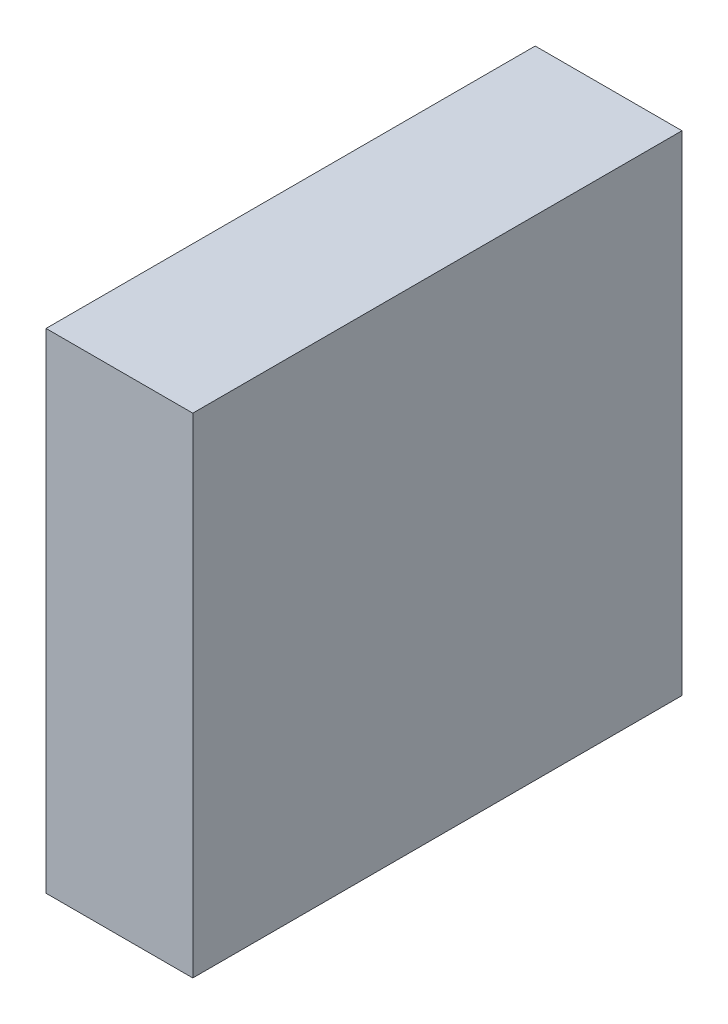
ISO-10303-21;
HEADER;
FILE_DESCRIPTION(('STEP AP214'),'2;1');
FILE_NAME('part.step','',(''),(''),'','','');
FILE_SCHEMA(('AUTOMOTIVE_DESIGN { 1 0 10303 214 1 1 1 1 }'));
ENDSEC;
DATA;
#1=APPLICATION_CONTEXT('core data for automotive mechanical design processes');
#2=APPLICATION_PROTOCOL_DEFINITION('international standard','automotive_design',2000,#1);
#3=PRODUCT_CONTEXT('',#1,'mechanical');
#4=PRODUCT('Part','Part','',(#3));
#5=PRODUCT_RELATED_PRODUCT_CATEGORY('part','',(#4));
#6=PRODUCT_DEFINITION_FORMATION('','',#4);
#7=PRODUCT_DEFINITION_CONTEXT('part definition',#1,'design');
#8=PRODUCT_DEFINITION('design','',#6,#7);
#9=PRODUCT_DEFINITION_SHAPE('','',#8);
#10=(LENGTH_UNIT() NAMED_UNIT(*) SI_UNIT(.MILLI.,.METRE.));
#11=(NAMED_UNIT(*) PLANE_ANGLE_UNIT() SI_UNIT($,.RADIAN.));
#12=(NAMED_UNIT(*) SI_UNIT($,.STERADIAN.) SOLID_ANGLE_UNIT());
#13=UNCERTAINTY_MEASURE_WITH_UNIT(LENGTH_MEASURE(1.E-05),#10,'distance_accuracy_value','');
#14=(GEOMETRIC_REPRESENTATION_CONTEXT(3) GLOBAL_UNCERTAINTY_ASSIGNED_CONTEXT((#13)) GLOBAL_UNIT_ASSIGNED_CONTEXT((#10,
#11,#12)) REPRESENTATION_CONTEXT('',''));
#15=CARTESIAN_POINT('',(0.,0.,0.));
#16=DIRECTION('',(0.,0.,1.));
#17=DIRECTION('',(1.,0.,0.));
#18=AXIS2_PLACEMENT_3D('',#15,#16,#17);
#19=CARTESIAN_POINT('',(0.9,1.5,-1.5));
#20=DIRECTION('',(0.,0.,1.));
#21=DIRECTION('',(0.,-1.,0.));
#22=AXIS2_PLACEMENT_3D('',#19,#20,#21);
#23=PLANE('',#22);
#24=DIRECTION('',(0.,1.,0.));
#25=VECTOR('',#24,1.);
#26=CARTESIAN_POINT('',(0.,1.5,-1.5));
#27=LINE('',#26,#25);
#28=CARTESIAN_POINT('',(0.,-1.5,-1.5));
#29=VERTEX_POINT('',#28);
#30=CARTESIAN_POINT('',(0.,1.5,-1.5));
#31=VERTEX_POINT('',#30);
#32=EDGE_CURVE('E100',#29,#31,#27,.T.);
#33=ORIENTED_EDGE('',*,*,#32,.T.);
#34=DIRECTION('',(-1.,0.,0.));
#35=VECTOR('',#34,1.);
#36=CARTESIAN_POINT('',(0.9,1.5,-1.5));
#37=LINE('',#36,#35);
#38=CARTESIAN_POINT('',(0.9,1.5,-1.5));
#39=VERTEX_POINT('',#38);
#40=EDGE_CURVE('E11',#39,#31,#37,.T.);
#41=ORIENTED_EDGE('',*,*,#40,.F.);
#42=DIRECTION('',(0.,1.,0.));
#43=VECTOR('',#42,1.);
#44=CARTESIAN_POINT('',(0.9,1.5,-1.5));
#45=LINE('',#44,#43);
#46=CARTESIAN_POINT('',(0.9,-1.5,-1.5));
#47=VERTEX_POINT('',#46);
#48=EDGE_CURVE('E88',#47,#39,#45,.T.);
#49=ORIENTED_EDGE('',*,*,#48,.F.);
#50=DIRECTION('',(-1.,0.,0.));
#51=VECTOR('',#50,1.);
#52=CARTESIAN_POINT('',(0.9,-1.5,-1.5));
#53=LINE('',#52,#51);
#54=EDGE_CURVE('E96',#47,#29,#53,.T.);
#55=ORIENTED_EDGE('',*,*,#54,.T.);
#56=EDGE_LOOP('',(#33,#41,#49,#55));
#57=FACE_BOUND('',#56,.T.);
#58=ADVANCED_FACE('F37',(#57),#23,.F.);
#59=CARTESIAN_POINT('',(0.9,1.5,1.5));
#60=DIRECTION('',(0.,-1.,0.));
#61=DIRECTION('',(0.,0.,-1.));
#62=AXIS2_PLACEMENT_3D('',#59,#60,#61);
#63=PLANE('',#62);
#64=DIRECTION('',(0.,0.,1.));
#65=VECTOR('',#64,1.);
#66=CARTESIAN_POINT('',(0.,1.5,1.5));
#67=LINE('',#66,#65);
#68=CARTESIAN_POINT('',(0.,1.5,1.5));
#69=VERTEX_POINT('',#68);
#70=EDGE_CURVE('E92',#31,#69,#67,.T.);
#71=ORIENTED_EDGE('',*,*,#70,.T.);
#72=DIRECTION('',(-1.,0.,0.));
#73=VECTOR('',#72,1.);
#74=CARTESIAN_POINT('',(0.9,1.5,1.5));
#75=LINE('',#74,#73);
#76=CARTESIAN_POINT('',(0.9,1.5,1.5));
#77=VERTEX_POINT('',#76);
#78=EDGE_CURVE('E45',#77,#69,#75,.T.);
#79=ORIENTED_EDGE('',*,*,#78,.F.);
#80=DIRECTION('',(0.,0.,1.));
#81=VECTOR('',#80,1.);
#82=CARTESIAN_POINT('',(0.9,1.5,1.5));
#83=LINE('',#82,#81);
#84=EDGE_CURVE('E83',#39,#77,#83,.T.);
#85=ORIENTED_EDGE('',*,*,#84,.F.);
#86=ORIENTED_EDGE('',*,*,#40,.T.);
#87=EDGE_LOOP('',(#71,#79,#85,#86));
#88=FACE_BOUND('',#87,.T.);
#89=ADVANCED_FACE('F91',(#88),#63,.F.);
#90=CARTESIAN_POINT('',(0.9,1.5,1.5));
#91=DIRECTION('',(0.,0.,-1.));
#92=DIRECTION('',(0.,1.,0.));
#93=AXIS2_PLACEMENT_3D('',#90,#91,#92);
#94=PLANE('',#93);
#95=DIRECTION('',(0.,-1.,0.));
#96=VECTOR('',#95,1.);
#97=CARTESIAN_POINT('',(0.,1.5,1.5));
#98=LINE('',#97,#96);
#99=CARTESIAN_POINT('',(0.,-1.5,1.5));
#100=VERTEX_POINT('',#99);
#101=EDGE_CURVE('E70',#69,#100,#98,.T.);
#102=ORIENTED_EDGE('',*,*,#101,.T.);
#103=DIRECTION('',(-1.,0.,0.));
#104=VECTOR('',#103,1.);
#105=CARTESIAN_POINT('',(0.9,-1.5,1.5));
#106=LINE('',#105,#104);
#107=CARTESIAN_POINT('',(0.9,-1.5,1.5));
#108=VERTEX_POINT('',#107);
#109=EDGE_CURVE('E93',#108,#100,#106,.T.);
#110=ORIENTED_EDGE('',*,*,#109,.F.);
#111=DIRECTION('',(0.,-1.,0.));
#112=VECTOR('',#111,1.);
#113=CARTESIAN_POINT('',(0.9,1.5,1.5));
#114=LINE('',#113,#112);
#115=EDGE_CURVE('E86',#77,#108,#114,.T.);
#116=ORIENTED_EDGE('',*,*,#115,.F.);
#117=ORIENTED_EDGE('',*,*,#78,.T.);
#118=EDGE_LOOP('',(#102,#110,#116,#117));
#119=FACE_BOUND('',#118,.T.);
#120=ADVANCED_FACE('F94',(#119),#94,.F.);
#121=CARTESIAN_POINT('',(0.9,-1.5,1.5));
#122=DIRECTION('',(0.,1.,0.));
#123=DIRECTION('',(0.,0.,1.));
#124=AXIS2_PLACEMENT_3D('',#121,#122,#123);
#125=PLANE('',#124);
#126=DIRECTION('',(0.,0.,-1.));
#127=VECTOR('',#126,1.);
#128=CARTESIAN_POINT('',(0.,-1.5,1.5));
#129=LINE('',#128,#127);
#130=EDGE_CURVE('E76',#100,#29,#129,.T.);
#131=ORIENTED_EDGE('',*,*,#130,.T.);
#132=ORIENTED_EDGE('',*,*,#54,.F.);
#133=DIRECTION('',(0.,0.,-1.));
#134=VECTOR('',#133,1.);
#135=CARTESIAN_POINT('',(0.9,-1.5,1.5));
#136=LINE('',#135,#134);
#137=EDGE_CURVE('E53',#108,#47,#136,.T.);
#138=ORIENTED_EDGE('',*,*,#137,.F.);
#139=ORIENTED_EDGE('',*,*,#109,.T.);
#140=EDGE_LOOP('',(#131,#132,#138,#139));
#141=FACE_BOUND('',#140,.T.);
#142=ADVANCED_FACE('F107',(#141),#125,.F.);
#143=CARTESIAN_POINT('',(0.9,0.,0.));
#144=DIRECTION('',(1.,0.,0.));
#145=DIRECTION('',(0.,0.,-1.));
#146=AXIS2_PLACEMENT_3D('',#143,#144,#145);
#147=PLANE('',#146);
#148=ORIENTED_EDGE('',*,*,#48,.T.);
#149=ORIENTED_EDGE('',*,*,#84,.T.);
#150=ORIENTED_EDGE('',*,*,#115,.T.);
#151=ORIENTED_EDGE('',*,*,#137,.T.);
#152=EDGE_LOOP('',(#148,#149,#150,#151));
#153=FACE_BOUND('',#152,.T.);
#154=ADVANCED_FACE('F84',(#153),#147,.T.);
#155=CARTESIAN_POINT('',(0.,0.,0.));
#156=DIRECTION('',(1.,0.,0.));
#157=DIRECTION('',(0.,0.,-1.));
#158=AXIS2_PLACEMENT_3D('',#155,#156,#157);
#159=PLANE('',#158);
#160=ORIENTED_EDGE('',*,*,#32,.F.);
#161=ORIENTED_EDGE('',*,*,#130,.F.);
#162=ORIENTED_EDGE('',*,*,#101,.F.);
#163=ORIENTED_EDGE('',*,*,#70,.F.);
#164=EDGE_LOOP('',(#160,#161,#162,#163));
#165=FACE_BOUND('',#164,.T.);
#166=ADVANCED_FACE('F110',(#165),#159,.F.);
#167=CLOSED_SHELL('',(#58,#89,#120,#142,#154,#166));
#168=MANIFOLD_SOLID_BREP('B2',#167);
#169=ADVANCED_BREP_SHAPE_REPRESENTATION('',(#18,#168),#14);
#170=SHAPE_DEFINITION_REPRESENTATION(#9,#169);
ENDSEC;
END-ISO-10303-21;
